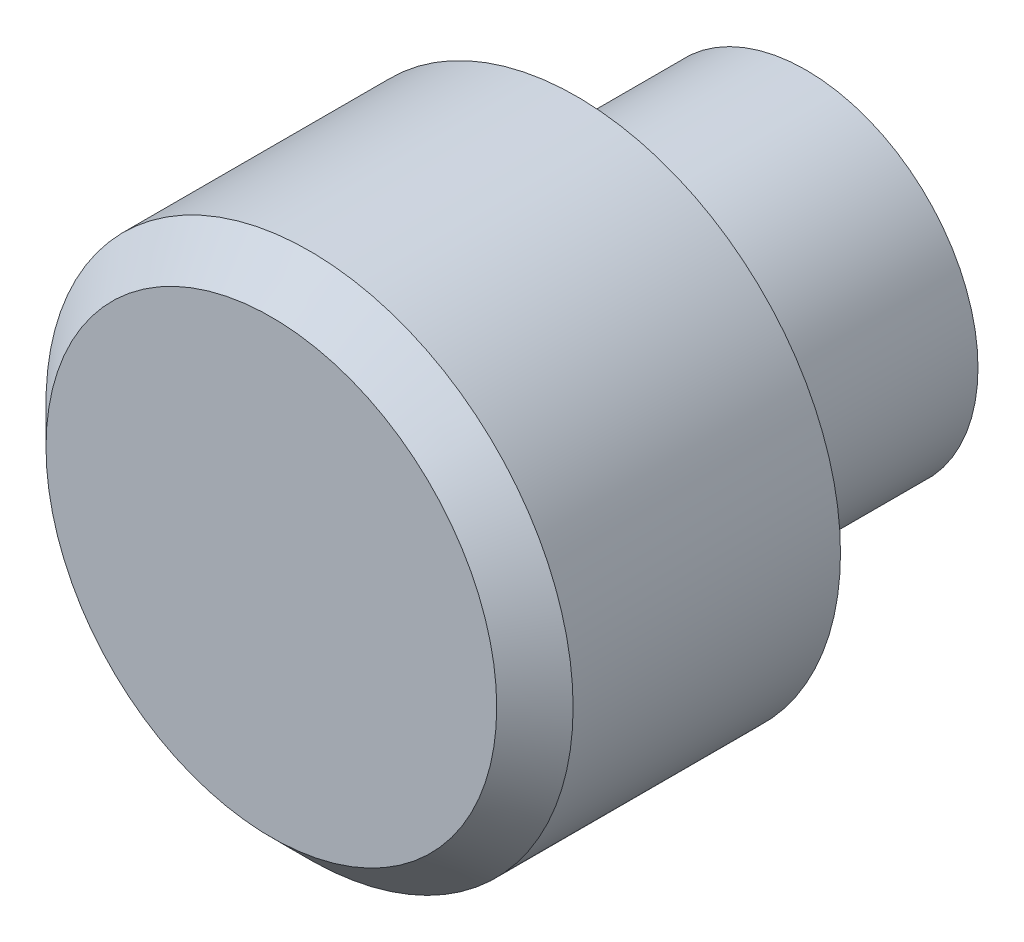
ISO-10303-21;
HEADER;
FILE_DESCRIPTION(('STEP AP214'),'2;1');
FILE_NAME('part.step','',(''),(''),'','','');
FILE_SCHEMA(('AUTOMOTIVE_DESIGN { 1 0 10303 214 1 1 1 1 }'));
ENDSEC;
DATA;
#1=APPLICATION_CONTEXT('core data for automotive mechanical design processes');
#2=APPLICATION_PROTOCOL_DEFINITION('international standard','automotive_design',2000,#1);
#3=PRODUCT_CONTEXT('',#1,'mechanical');
#4=PRODUCT('Part','Part','',(#3));
#5=PRODUCT_RELATED_PRODUCT_CATEGORY('part','',(#4));
#6=PRODUCT_DEFINITION_FORMATION('','',#4);
#7=PRODUCT_DEFINITION_CONTEXT('part definition',#1,'design');
#8=PRODUCT_DEFINITION('design','',#6,#7);
#9=PRODUCT_DEFINITION_SHAPE('','',#8);
#10=(LENGTH_UNIT() NAMED_UNIT(*) SI_UNIT(.MILLI.,.METRE.));
#11=(NAMED_UNIT(*) PLANE_ANGLE_UNIT() SI_UNIT($,.RADIAN.));
#12=(NAMED_UNIT(*) SI_UNIT($,.STERADIAN.) SOLID_ANGLE_UNIT());
#13=UNCERTAINTY_MEASURE_WITH_UNIT(LENGTH_MEASURE(1.E-05),#10,'distance_accuracy_value','');
#14=(GEOMETRIC_REPRESENTATION_CONTEXT(3) GLOBAL_UNCERTAINTY_ASSIGNED_CONTEXT((#13)) GLOBAL_UNIT_ASSIGNED_CONTEXT((#10,
#11,#12)) REPRESENTATION_CONTEXT('',''));
#15=CARTESIAN_POINT('',(0.,0.,0.));
#16=DIRECTION('',(0.,0.,1.));
#17=DIRECTION('',(1.,0.,0.));
#18=AXIS2_PLACEMENT_3D('',#15,#16,#17);
#19=CARTESIAN_POINT('',(0.,0.,15.));
#20=DIRECTION('',(0.,0.,-1.));
#21=DIRECTION('',(-1.,0.,0.));
#22=AXIS2_PLACEMENT_3D('',#19,#20,#21);
#23=CYLINDRICAL_SURFACE('',#22,11.25);
#24=CARTESIAN_POINT('',(0.,0.,15.));
#25=DIRECTION('',(0.,0.,1.));
#26=DIRECTION('',(1.,0.,0.));
#27=AXIS2_PLACEMENT_3D('',#24,#25,#26);
#28=CIRCLE('',#27,11.25);
#29=CARTESIAN_POINT('',(11.25,0.,15.));
#30=VERTEX_POINT('',#29);
#31=EDGE_CURVE('E51',#30,#30,#28,.T.);
#32=ORIENTED_EDGE('',*,*,#31,.F.);
#33=EDGE_LOOP('',(#32));
#34=FACE_BOUND('',#33,.T.);
#35=CARTESIAN_POINT('',(0.,0.,0.));
#36=DIRECTION('',(0.,0.,1.));
#37=DIRECTION('',(1.,0.,0.));
#38=AXIS2_PLACEMENT_3D('',#35,#36,#37);
#39=CIRCLE('',#38,11.25);
#40=CARTESIAN_POINT('',(11.25,0.,0.));
#41=VERTEX_POINT('',#40);
#42=EDGE_CURVE('E55',#41,#41,#39,.T.);
#43=ORIENTED_EDGE('',*,*,#42,.T.);
#44=EDGE_LOOP('',(#43));
#45=FACE_BOUND('',#44,.T.);
#46=ADVANCED_FACE('F39',(#34,#45),#23,.T.);
#47=CARTESIAN_POINT('',(0.,0.,0.));
#48=DIRECTION('',(0.,0.,1.));
#49=DIRECTION('',(1.,0.,0.));
#50=AXIS2_PLACEMENT_3D('',#47,#48,#49);
#51=PLANE('',#50);
#52=ORIENTED_EDGE('',*,*,#42,.F.);
#53=EDGE_LOOP('',(#52));
#54=FACE_BOUND('',#53,.T.);
#55=ADVANCED_FACE('F79',(#54),#51,.F.);
#56=CARTESIAN_POINT('',(0.,0.,35.));
#57=DIRECTION('',(0.,0.,-1.));
#58=DIRECTION('',(-1.,0.,0.));
#59=AXIS2_PLACEMENT_3D('',#56,#57,#58);
#60=CYLINDRICAL_SURFACE('',#59,17.25);
#61=CARTESIAN_POINT('',(0.,0.,32.5));
#62=DIRECTION('',(0.,0.,1.));
#63=DIRECTION('',(1.,0.,0.));
#64=AXIS2_PLACEMENT_3D('',#61,#62,#63);
#65=CIRCLE('',#64,17.25);
#66=CARTESIAN_POINT('',(17.25,0.,32.5));
#67=VERTEX_POINT('',#66);
#68=EDGE_CURVE('E10',#67,#67,#65,.F.);
#69=ORIENTED_EDGE('',*,*,#68,.T.);
#70=EDGE_LOOP('',(#69));
#71=FACE_BOUND('',#70,.T.);
#72=CARTESIAN_POINT('',(0.,0.,15.));
#73=DIRECTION('',(0.,0.,1.));
#74=DIRECTION('',(1.,0.,0.));
#75=AXIS2_PLACEMENT_3D('',#72,#73,#74);
#76=CIRCLE('',#75,17.25);
#77=CARTESIAN_POINT('',(17.25,0.,15.));
#78=VERTEX_POINT('',#77);
#79=EDGE_CURVE('E59',#78,#78,#76,.T.);
#80=ORIENTED_EDGE('',*,*,#79,.T.);
#81=EDGE_LOOP('',(#80));
#82=FACE_BOUND('',#81,.T.);
#83=ADVANCED_FACE('F64',(#71,#82),#60,.T.);
#84=CARTESIAN_POINT('',(0.,0.,35.));
#85=DIRECTION('',(0.,0.,1.));
#86=DIRECTION('',(1.,0.,0.));
#87=AXIS2_PLACEMENT_3D('',#84,#85,#86);
#88=PLANE('',#87);
#89=CARTESIAN_POINT('',(0.,0.,35.));
#90=DIRECTION('',(0.,0.,1.));
#91=DIRECTION('',(1.,0.,0.));
#92=AXIS2_PLACEMENT_3D('',#89,#90,#91);
#93=CIRCLE('',#92,14.75);
#94=CARTESIAN_POINT('',(14.75,0.,35.));
#95=VERTEX_POINT('',#94);
#96=EDGE_CURVE('E47',#95,#95,#93,.T.);
#97=ORIENTED_EDGE('',*,*,#96,.T.);
#98=EDGE_LOOP('',(#97));
#99=FACE_BOUND('',#98,.T.);
#100=ADVANCED_FACE('F68',(#99),#88,.T.);
#101=CARTESIAN_POINT('',(0.,0.,15.));
#102=DIRECTION('',(0.,0.,1.));
#103=DIRECTION('',(1.,0.,0.));
#104=AXIS2_PLACEMENT_3D('',#101,#102,#103);
#105=PLANE('',#104);
#106=ORIENTED_EDGE('',*,*,#31,.T.);
#107=EDGE_LOOP('',(#106));
#108=FACE_BOUND('',#107,.T.);
#109=ORIENTED_EDGE('',*,*,#79,.F.);
#110=EDGE_LOOP('',(#109));
#111=FACE_BOUND('',#110,.T.);
#112=ADVANCED_FACE('F66',(#108,#111),#105,.F.);
#113=CARTESIAN_POINT('',(0.,0.,35.));
#114=DIRECTION('',(0.,0.,-1.));
#115=DIRECTION('',(-1.,0.,0.));
#116=AXIS2_PLACEMENT_3D('',#113,#114,#115);
#117=CONICAL_SURFACE('',#116,14.75,0.785398163397446);
#118=ORIENTED_EDGE('',*,*,#68,.F.);
#119=EDGE_LOOP('',(#118));
#120=FACE_BOUND('',#119,.T.);
#121=ORIENTED_EDGE('',*,*,#96,.F.);
#122=EDGE_LOOP('',(#121));
#123=FACE_BOUND('',#122,.T.);
#124=ADVANCED_FACE('F42',(#120,#123),#117,.T.);
#125=CLOSED_SHELL('',(#46,#55,#83,#100,#112,#124));
#126=MANIFOLD_SOLID_BREP('B2',#125);
#127=ADVANCED_BREP_SHAPE_REPRESENTATION('',(#18,#126),#14);
#128=SHAPE_DEFINITION_REPRESENTATION(#9,#127);
ENDSEC;
END-ISO-10303-21;
